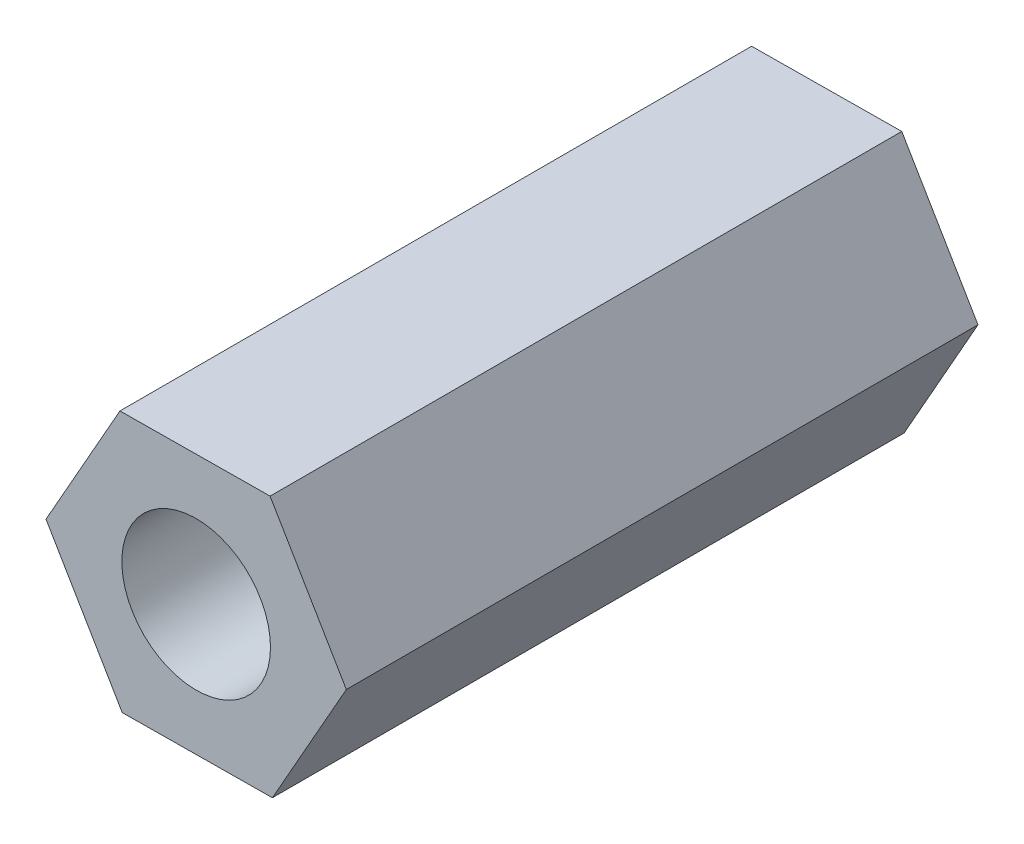
ISO-10303-21;
HEADER;
FILE_DESCRIPTION(('STEP AP214'),'2;1');
FILE_NAME('part.step','',(''),(''),'','','');
FILE_SCHEMA(('AUTOMOTIVE_DESIGN { 1 0 10303 214 1 1 1 1 }'));
ENDSEC;
DATA;
#1=APPLICATION_CONTEXT('core data for automotive mechanical design processes');
#2=APPLICATION_PROTOCOL_DEFINITION('international standard','automotive_design',2000,#1);
#3=PRODUCT_CONTEXT('',#1,'mechanical');
#4=PRODUCT('Part','Part','',(#3));
#5=PRODUCT_RELATED_PRODUCT_CATEGORY('part','',(#4));
#6=PRODUCT_DEFINITION_FORMATION('','',#4);
#7=PRODUCT_DEFINITION_CONTEXT('part definition',#1,'design');
#8=PRODUCT_DEFINITION('design','',#6,#7);
#9=PRODUCT_DEFINITION_SHAPE('','',#8);
#10=(LENGTH_UNIT() NAMED_UNIT(*) SI_UNIT(.MILLI.,.METRE.));
#11=(NAMED_UNIT(*) PLANE_ANGLE_UNIT() SI_UNIT($,.RADIAN.));
#12=(NAMED_UNIT(*) SI_UNIT($,.STERADIAN.) SOLID_ANGLE_UNIT());
#13=UNCERTAINTY_MEASURE_WITH_UNIT(LENGTH_MEASURE(1.E-05),#10,'distance_accuracy_value','');
#14=(GEOMETRIC_REPRESENTATION_CONTEXT(3) GLOBAL_UNCERTAINTY_ASSIGNED_CONTEXT((#13)) GLOBAL_UNIT_ASSIGNED_CONTEXT((#10,
#11,#12)) REPRESENTATION_CONTEXT('',''));
#15=CARTESIAN_POINT('',(0.,0.,0.));
#16=DIRECTION('',(0.,0.,1.));
#17=DIRECTION('',(1.,0.,0.));
#18=AXIS2_PLACEMENT_3D('',#15,#16,#17);
#19=CARTESIAN_POINT('',(0.,0.,17.));
#20=DIRECTION('',(0.,0.,1.));
#21=DIRECTION('',(1.,0.,0.));
#22=AXIS2_PLACEMENT_3D('',#19,#20,#21);
#23=PLANE('',#22);
#24=DIRECTION('',(0.999961257640527,0.00880245522430722,0.));
#25=VECTOR('',#24,1.);
#26=CARTESIAN_POINT('',(-1.98983906118775,-3.51765175136834,17.));
#27=LINE('',#26,#25);
#28=CARTESIAN_POINT('',(-1.98983906118775,-3.51765175136834,17.));
#29=VERTEX_POINT('',#28);
#30=CARTESIAN_POINT('',(2.05145624775792,-3.48207705211536,17.));
#31=VERTEX_POINT('',#30);
#32=EDGE_CURVE('E146',#29,#31,#27,.T.);
#33=ORIENTED_EDGE('',*,*,#32,.T.);
#34=DIRECTION('',(0.492357478980338,0.870393079529086,0.));
#35=VECTOR('',#34,1.);
#36=CARTESIAN_POINT('',(2.05145624775792,-3.48207705211536,17.));
#37=LINE('',#36,#35);
#38=CARTESIAN_POINT('',(4.04129530894568,0.0355746992529791,17.));
#39=VERTEX_POINT('',#38);
#40=EDGE_CURVE('E94',#31,#39,#37,.T.);
#41=ORIENTED_EDGE('',*,*,#40,.T.);
#42=DIRECTION('',(-0.507603778660189,0.861590624304779,0.));
#43=VECTOR('',#42,1.);
#44=CARTESIAN_POINT('',(4.04129530894568,0.0355746992529791,17.));
#45=LINE('',#44,#43);
#46=CARTESIAN_POINT('',(1.98983906118776,3.51765175136834,17.));
#47=VERTEX_POINT('',#46);
#48=EDGE_CURVE('E107',#39,#47,#45,.T.);
#49=ORIENTED_EDGE('',*,*,#48,.T.);
#50=DIRECTION('',(-0.999961257640527,-0.00880245522430723,0.));
#51=VECTOR('',#50,1.);
#52=CARTESIAN_POINT('',(1.98983906118776,3.51765175136834,17.));
#53=LINE('',#52,#51);
#54=CARTESIAN_POINT('',(-2.05145624775791,3.48207705211536,17.));
#55=VERTEX_POINT('',#54);
#56=EDGE_CURVE('E101',#47,#55,#53,.T.);
#57=ORIENTED_EDGE('',*,*,#56,.T.);
#58=DIRECTION('',(-0.492357478980338,-0.870393079529086,0.));
#59=VECTOR('',#58,1.);
#60=CARTESIAN_POINT('',(-2.05145624775791,3.48207705211536,17.));
#61=LINE('',#60,#59);
#62=CARTESIAN_POINT('',(-4.04129530894568,-0.0355746992529825,17.));
#63=VERTEX_POINT('',#62);
#64=EDGE_CURVE('E105',#55,#63,#61,.T.);
#65=ORIENTED_EDGE('',*,*,#64,.T.);
#66=DIRECTION('',(0.507603778660189,-0.861590624304779,0.));
#67=VECTOR('',#66,1.);
#68=CARTESIAN_POINT('',(-4.04129530894568,-0.0355746992529825,17.));
#69=LINE('',#68,#67);
#70=EDGE_CURVE('E57',#63,#29,#69,.T.);
#71=ORIENTED_EDGE('',*,*,#70,.T.);
#72=EDGE_LOOP('',(#33,#41,#49,#57,#65,#71));
#73=FACE_BOUND('',#72,.T.);
#74=CARTESIAN_POINT('',(0.,0.,17.));
#75=DIRECTION('',(0.,0.,1.));
#76=DIRECTION('',(1.,0.,0.));
#77=AXIS2_PLACEMENT_3D('',#74,#75,#76);
#78=CIRCLE('',#77,2.);
#79=CARTESIAN_POINT('',(2.,0.,17.));
#80=VERTEX_POINT('',#79);
#81=EDGE_CURVE('E134',#80,#80,#78,.T.);
#82=ORIENTED_EDGE('',*,*,#81,.F.);
#83=EDGE_LOOP('',(#82));
#84=FACE_BOUND('',#83,.T.);
#85=ADVANCED_FACE('F39',(#73,#84),#23,.T.);
#86=CARTESIAN_POINT('',(0.,0.,0.));
#87=DIRECTION('',(0.,0.,1.));
#88=DIRECTION('',(1.,0.,0.));
#89=AXIS2_PLACEMENT_3D('',#86,#87,#88);
#90=PLANE('',#89);
#91=DIRECTION('',(0.999961257640527,0.00880245522430722,0.));
#92=VECTOR('',#91,1.);
#93=CARTESIAN_POINT('',(-1.98983906118775,-3.51765175136834,0.));
#94=LINE('',#93,#92);
#95=CARTESIAN_POINT('',(-1.98983906118775,-3.51765175136834,0.));
#96=VERTEX_POINT('',#95);
#97=CARTESIAN_POINT('',(2.05145624775792,-3.48207705211536,0.));
#98=VERTEX_POINT('',#97);
#99=EDGE_CURVE('E129',#96,#98,#94,.T.);
#100=ORIENTED_EDGE('',*,*,#99,.F.);
#101=DIRECTION('',(0.507603778660189,-0.861590624304779,0.));
#102=VECTOR('',#101,1.);
#103=CARTESIAN_POINT('',(-4.04129530894568,-0.0355746992529825,0.));
#104=LINE('',#103,#102);
#105=CARTESIAN_POINT('',(-4.04129530894568,-0.0355746992529825,0.));
#106=VERTEX_POINT('',#105);
#107=EDGE_CURVE('E86',#106,#96,#104,.T.);
#108=ORIENTED_EDGE('',*,*,#107,.F.);
#109=DIRECTION('',(-0.492357478980338,-0.870393079529086,0.));
#110=VECTOR('',#109,1.);
#111=CARTESIAN_POINT('',(-2.05145624775791,3.48207705211536,0.));
#112=LINE('',#111,#110);
#113=CARTESIAN_POINT('',(-2.05145624775791,3.48207705211536,0.));
#114=VERTEX_POINT('',#113);
#115=EDGE_CURVE('E80',#114,#106,#112,.T.);
#116=ORIENTED_EDGE('',*,*,#115,.F.);
#117=DIRECTION('',(-0.999961257640527,-0.00880245522430723,0.));
#118=VECTOR('',#117,1.);
#119=CARTESIAN_POINT('',(1.98983906118776,3.51765175136834,0.));
#120=LINE('',#119,#118);
#121=CARTESIAN_POINT('',(1.98983906118776,3.51765175136834,0.));
#122=VERTEX_POINT('',#121);
#123=EDGE_CURVE('E116',#122,#114,#120,.T.);
#124=ORIENTED_EDGE('',*,*,#123,.F.);
#125=DIRECTION('',(-0.507603778660189,0.861590624304779,0.));
#126=VECTOR('',#125,1.);
#127=CARTESIAN_POINT('',(4.04129530894568,0.0355746992529791,0.));
#128=LINE('',#127,#126);
#129=CARTESIAN_POINT('',(4.04129530894568,0.0355746992529791,0.));
#130=VERTEX_POINT('',#129);
#131=EDGE_CURVE('E137',#130,#122,#128,.T.);
#132=ORIENTED_EDGE('',*,*,#131,.F.);
#133=DIRECTION('',(0.492357478980338,0.870393079529086,0.));
#134=VECTOR('',#133,1.);
#135=CARTESIAN_POINT('',(2.05145624775792,-3.48207705211536,0.));
#136=LINE('',#135,#134);
#137=EDGE_CURVE('E133',#98,#130,#136,.T.);
#138=ORIENTED_EDGE('',*,*,#137,.F.);
#139=EDGE_LOOP('',(#100,#108,#116,#124,#132,#138));
#140=FACE_BOUND('',#139,.T.);
#141=CARTESIAN_POINT('',(0.,0.,0.));
#142=DIRECTION('',(0.,0.,1.));
#143=DIRECTION('',(1.,0.,0.));
#144=AXIS2_PLACEMENT_3D('',#141,#142,#143);
#145=CIRCLE('',#144,2.);
#146=CARTESIAN_POINT('',(2.,0.,0.));
#147=VERTEX_POINT('',#146);
#148=EDGE_CURVE('E243',#147,#147,#145,.T.);
#149=ORIENTED_EDGE('',*,*,#148,.T.);
#150=EDGE_LOOP('',(#149));
#151=FACE_BOUND('',#150,.T.);
#152=ADVANCED_FACE('F159',(#140,#151),#90,.F.);
#153=CARTESIAN_POINT('',(-1.98983906118775,-3.51765175136834,17.));
#154=DIRECTION('',(-0.00880245522430722,0.999961257640527,0.));
#155=DIRECTION('',(-0.999961257640527,-0.00880245522430722,0.));
#156=AXIS2_PLACEMENT_3D('',#153,#154,#155);
#157=PLANE('',#156);
#158=ORIENTED_EDGE('',*,*,#99,.T.);
#159=DIRECTION('',(0.,0.,-1.));
#160=VECTOR('',#159,1.);
#161=CARTESIAN_POINT('',(2.05145624775792,-3.48207705211536,17.));
#162=LINE('',#161,#160);
#163=EDGE_CURVE('E11',#31,#98,#162,.T.);
#164=ORIENTED_EDGE('',*,*,#163,.F.);
#165=ORIENTED_EDGE('',*,*,#32,.F.);
#166=DIRECTION('',(0.,0.,-1.));
#167=VECTOR('',#166,1.);
#168=CARTESIAN_POINT('',(-1.98983906118775,-3.51765175136834,17.));
#169=LINE('',#168,#167);
#170=EDGE_CURVE('E125',#29,#96,#169,.T.);
#171=ORIENTED_EDGE('',*,*,#170,.T.);
#172=EDGE_LOOP('',(#158,#164,#165,#171));
#173=FACE_BOUND('',#172,.T.);
#174=ADVANCED_FACE('F41',(#173),#157,.F.);
#175=CARTESIAN_POINT('',(2.05145624775792,-3.48207705211536,17.));
#176=DIRECTION('',(-0.870393079529086,0.492357478980338,0.));
#177=DIRECTION('',(-0.492357478980338,-0.870393079529086,0.));
#178=AXIS2_PLACEMENT_3D('',#175,#176,#177);
#179=PLANE('',#178);
#180=ORIENTED_EDGE('',*,*,#137,.T.);
#181=DIRECTION('',(0.,0.,-1.));
#182=VECTOR('',#181,1.);
#183=CARTESIAN_POINT('',(4.04129530894568,0.0355746992529791,17.));
#184=LINE('',#183,#182);
#185=EDGE_CURVE('E49',#39,#130,#184,.T.);
#186=ORIENTED_EDGE('',*,*,#185,.F.);
#187=ORIENTED_EDGE('',*,*,#40,.F.);
#188=ORIENTED_EDGE('',*,*,#163,.T.);
#189=EDGE_LOOP('',(#180,#186,#187,#188));
#190=FACE_BOUND('',#189,.T.);
#191=ADVANCED_FACE('F184',(#190),#179,.F.);
#192=CARTESIAN_POINT('',(4.04129530894568,0.0355746992529791,17.));
#193=DIRECTION('',(-0.861590624304779,-0.507603778660189,0.));
#194=DIRECTION('',(0.507603778660189,-0.861590624304779,0.));
#195=AXIS2_PLACEMENT_3D('',#192,#193,#194);
#196=PLANE('',#195);
#197=ORIENTED_EDGE('',*,*,#131,.T.);
#198=DIRECTION('',(0.,0.,-1.));
#199=VECTOR('',#198,1.);
#200=CARTESIAN_POINT('',(1.98983906118776,3.51765175136834,17.));
#201=LINE('',#200,#199);
#202=EDGE_CURVE('E118',#47,#122,#201,.T.);
#203=ORIENTED_EDGE('',*,*,#202,.F.);
#204=ORIENTED_EDGE('',*,*,#48,.F.);
#205=ORIENTED_EDGE('',*,*,#185,.T.);
#206=EDGE_LOOP('',(#197,#203,#204,#205));
#207=FACE_BOUND('',#206,.T.);
#208=ADVANCED_FACE('F156',(#207),#196,.F.);
#209=CARTESIAN_POINT('',(1.98983906118776,3.51765175136834,17.));
#210=DIRECTION('',(0.00880245522430723,-0.999961257640527,0.));
#211=DIRECTION('',(0.999961257640527,0.00880245522430723,0.));
#212=AXIS2_PLACEMENT_3D('',#209,#210,#211);
#213=PLANE('',#212);
#214=ORIENTED_EDGE('',*,*,#123,.T.);
#215=DIRECTION('',(0.,0.,-1.));
#216=VECTOR('',#215,1.);
#217=CARTESIAN_POINT('',(-2.05145624775791,3.48207705211536,17.));
#218=LINE('',#217,#216);
#219=EDGE_CURVE('E113',#55,#114,#218,.T.);
#220=ORIENTED_EDGE('',*,*,#219,.F.);
#221=ORIENTED_EDGE('',*,*,#56,.F.);
#222=ORIENTED_EDGE('',*,*,#202,.T.);
#223=EDGE_LOOP('',(#214,#220,#221,#222));
#224=FACE_BOUND('',#223,.T.);
#225=ADVANCED_FACE('F114',(#224),#213,.F.);
#226=CARTESIAN_POINT('',(-2.05145624775791,3.48207705211536,17.));
#227=DIRECTION('',(0.870393079529086,-0.492357478980338,0.));
#228=DIRECTION('',(0.492357478980338,0.870393079529086,0.));
#229=AXIS2_PLACEMENT_3D('',#226,#227,#228);
#230=PLANE('',#229);
#231=ORIENTED_EDGE('',*,*,#115,.T.);
#232=DIRECTION('',(0.,0.,-1.));
#233=VECTOR('',#232,1.);
#234=CARTESIAN_POINT('',(-4.04129530894568,-0.0355746992529825,17.));
#235=LINE('',#234,#233);
#236=EDGE_CURVE('E119',#63,#106,#235,.T.);
#237=ORIENTED_EDGE('',*,*,#236,.F.);
#238=ORIENTED_EDGE('',*,*,#64,.F.);
#239=ORIENTED_EDGE('',*,*,#219,.T.);
#240=EDGE_LOOP('',(#231,#237,#238,#239));
#241=FACE_BOUND('',#240,.T.);
#242=ADVANCED_FACE('F121',(#241),#230,.F.);
#243=CARTESIAN_POINT('',(-4.04129530894568,-0.0355746992529825,17.));
#244=DIRECTION('',(0.861590624304779,0.507603778660189,0.));
#245=DIRECTION('',(-0.507603778660189,0.861590624304779,0.));
#246=AXIS2_PLACEMENT_3D('',#243,#244,#245);
#247=PLANE('',#246);
#248=ORIENTED_EDGE('',*,*,#107,.T.);
#249=ORIENTED_EDGE('',*,*,#170,.F.);
#250=ORIENTED_EDGE('',*,*,#70,.F.);
#251=ORIENTED_EDGE('',*,*,#236,.T.);
#252=EDGE_LOOP('',(#248,#249,#250,#251));
#253=FACE_BOUND('',#252,.T.);
#254=ADVANCED_FACE('F164',(#253),#247,.F.);
#255=CARTESIAN_POINT('',(0.,0.,17.));
#256=DIRECTION('',(0.,0.,-1.));
#257=DIRECTION('',(-1.,0.,0.));
#258=AXIS2_PLACEMENT_3D('',#255,#256,#257);
#259=CYLINDRICAL_SURFACE('',#258,2.);
#260=ORIENTED_EDGE('',*,*,#81,.T.);
#261=EDGE_LOOP('',(#260));
#262=FACE_BOUND('',#261,.T.);
#263=ORIENTED_EDGE('',*,*,#148,.F.);
#264=EDGE_LOOP('',(#263));
#265=FACE_BOUND('',#264,.T.);
#266=ADVANCED_FACE('F166',(#262,#265),#259,.F.);
#267=CLOSED_SHELL('',(#85,#152,#174,#191,#208,#225,#242,#254,#266));
#268=MANIFOLD_SOLID_BREP('B2',#267);
#269=ADVANCED_BREP_SHAPE_REPRESENTATION('',(#18,#268),#14);
#270=SHAPE_DEFINITION_REPRESENTATION(#9,#269);
ENDSEC;
END-ISO-10303-21;
